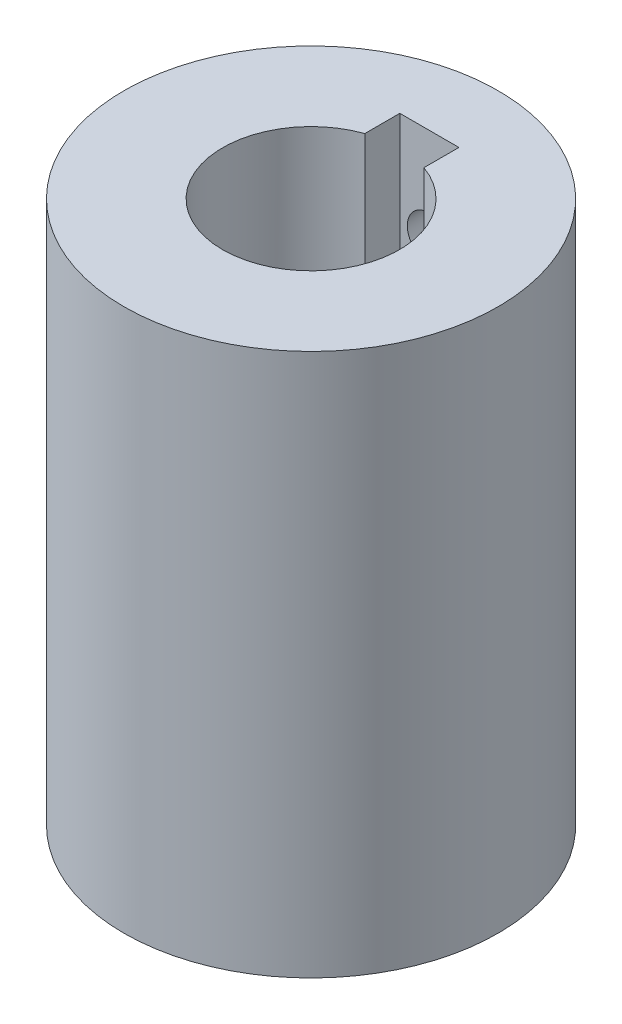
ISO-10303-21;
HEADER;
FILE_DESCRIPTION(('STEP AP214'),'2;1');
FILE_NAME('part.step','',(''),(''),'','','');
FILE_SCHEMA(('AUTOMOTIVE_DESIGN { 1 0 10303 214 1 1 1 1 }'));
ENDSEC;
DATA;
#1=APPLICATION_CONTEXT('core data for automotive mechanical design processes');
#2=APPLICATION_PROTOCOL_DEFINITION('international standard','automotive_design',2000,#1);
#3=PRODUCT_CONTEXT('',#1,'mechanical');
#4=PRODUCT('Part','Part','',(#3));
#5=PRODUCT_RELATED_PRODUCT_CATEGORY('part','',(#4));
#6=PRODUCT_DEFINITION_FORMATION('','',#4);
#7=PRODUCT_DEFINITION_CONTEXT('part definition',#1,'design');
#8=PRODUCT_DEFINITION('design','',#6,#7);
#9=PRODUCT_DEFINITION_SHAPE('','',#8);
#10=(LENGTH_UNIT() NAMED_UNIT(*) SI_UNIT(.MILLI.,.METRE.));
#11=(NAMED_UNIT(*) PLANE_ANGLE_UNIT() SI_UNIT($,.RADIAN.));
#12=(NAMED_UNIT(*) SI_UNIT($,.STERADIAN.) SOLID_ANGLE_UNIT());
#13=UNCERTAINTY_MEASURE_WITH_UNIT(LENGTH_MEASURE(1.E-05),#10,'distance_accuracy_value','');
#14=(GEOMETRIC_REPRESENTATION_CONTEXT(3) GLOBAL_UNCERTAINTY_ASSIGNED_CONTEXT((#13)) GLOBAL_UNIT_ASSIGNED_CONTEXT((#10,
#11,#12)) REPRESENTATION_CONTEXT('',''));
#15=CARTESIAN_POINT('',(0.,0.,0.));
#16=DIRECTION('',(0.,0.,1.));
#17=DIRECTION('',(1.,0.,0.));
#18=AXIS2_PLACEMENT_3D('',#15,#16,#17);
#19=CARTESIAN_POINT('',(0.,18.415,0.));
#20=DIRECTION('',(0.,-1.,0.));
#21=DIRECTION('',(0.,0.,-1.));
#22=AXIS2_PLACEMENT_3D('',#19,#20,#21);
#23=PLANE('',#22);
#24=CARTESIAN_POINT('',(0.,18.415,0.));
#25=DIRECTION('',(0.,-1.,0.));
#26=DIRECTION('',(0.,0.,-1.));
#27=AXIS2_PLACEMENT_3D('',#24,#25,#26);
#28=CIRCLE('',#27,6.);
#29=CARTESIAN_POINT('',(3.67958977400672,18.415,-4.73926356040948));
#30=VERTEX_POINT('',#29);
#31=CARTESIAN_POINT('',(2.26452775154114,18.415,-5.55625));
#32=VERTEX_POINT('',#31);
#33=EDGE_CURVE('E315',#30,#32,#28,.F.);
#34=ORIENTED_EDGE('',*,*,#33,.T.);
#35=DIRECTION('',(-1.,0.,0.));
#36=VECTOR('',#35,1.);
#37=CARTESIAN_POINT('',(0.,18.415,-5.55625));
#38=LINE('',#37,#36);
#39=CARTESIAN_POINT('',(3.20790243318486,18.415,-5.55625));
#40=VERTEX_POINT('',#39);
#41=EDGE_CURVE('E245',#40,#32,#38,.T.);
#42=ORIENTED_EDGE('',*,*,#41,.F.);
#43=DIRECTION('',(-0.5,0.,-0.866025403784439));
#44=VECTOR('',#43,1.);
#45=CARTESIAN_POINT('',(4.81185364977729,18.415,-2.778125));
#46=LINE('',#45,#44);
#47=EDGE_CURVE('E211',#30,#40,#46,.T.);
#48=ORIENTED_EDGE('',*,*,#47,.F.);
#49=EDGE_LOOP('',(#34,#42,#48));
#50=FACE_BOUND('',#49,.T.);
#51=ADVANCED_FACE('F41',(#50),#23,.T.);
#52=DIRECTION('',(-0.5,0.,0.866025403784439));
#53=VECTOR('',#52,1.);
#54=CARTESIAN_POINT('',(-4.81185364977729,18.415,-2.778125));
#55=LINE('',#54,#53);
#56=CARTESIAN_POINT('',(-3.20790243318486,18.415,-5.55625));
#57=VERTEX_POINT('',#56);
#58=CARTESIAN_POINT('',(-3.67958977400671,18.415,-4.73926356040949));
#59=VERTEX_POINT('',#58);
#60=EDGE_CURVE('E281',#57,#59,#55,.T.);
#61=ORIENTED_EDGE('',*,*,#60,.F.);
#62=CARTESIAN_POINT('',(-2.26452775154114,18.415,-5.55625));
#63=VERTEX_POINT('',#62);
#64=EDGE_CURVE('E70',#63,#57,#38,.T.);
#65=ORIENTED_EDGE('',*,*,#64,.F.);
#66=EDGE_CURVE('E330',#63,#59,#28,.F.);
#67=ORIENTED_EDGE('',*,*,#66,.T.);
#68=EDGE_LOOP('',(#61,#65,#67));
#69=FACE_BOUND('',#68,.T.);
#70=ADVANCED_FACE('F426',(#69),#23,.T.);
#71=CARTESIAN_POINT('',(5.94411752554786,18.415,0.816986439590518));
#72=VERTEX_POINT('',#71);
#73=CARTESIAN_POINT('',(5.94411752554786,18.415,-0.816986439590517));
#74=VERTEX_POINT('',#73);
#75=EDGE_CURVE('E384',#72,#74,#28,.F.);
#76=ORIENTED_EDGE('',*,*,#75,.T.);
#77=CARTESIAN_POINT('',(6.41580486636972,18.415,0.));
#78=VERTEX_POINT('',#77);
#79=EDGE_CURVE('E200',#78,#74,#46,.T.);
#80=ORIENTED_EDGE('',*,*,#79,.F.);
#81=DIRECTION('',(0.5,0.,-0.866025403784439));
#82=VECTOR('',#81,1.);
#83=CARTESIAN_POINT('',(4.81185364977729,18.415,2.778125));
#84=LINE('',#83,#82);
#85=EDGE_CURVE('E199',#72,#78,#84,.T.);
#86=ORIENTED_EDGE('',*,*,#85,.F.);
#87=EDGE_LOOP('',(#76,#80,#86));
#88=FACE_BOUND('',#87,.T.);
#89=ADVANCED_FACE('F431',(#88),#23,.T.);
#90=CARTESIAN_POINT('',(2.26452775154114,18.415,5.55625));
#91=VERTEX_POINT('',#90);
#92=CARTESIAN_POINT('',(3.67958977400672,18.415,4.73926356040949));
#93=VERTEX_POINT('',#92);
#94=EDGE_CURVE('E370',#91,#93,#28,.F.);
#95=ORIENTED_EDGE('',*,*,#94,.T.);
#96=CARTESIAN_POINT('',(3.20790243318486,18.415,5.55625));
#97=VERTEX_POINT('',#96);
#98=EDGE_CURVE('E257',#97,#93,#84,.T.);
#99=ORIENTED_EDGE('',*,*,#98,.F.);
#100=DIRECTION('',(1.,0.,0.));
#101=VECTOR('',#100,1.);
#102=CARTESIAN_POINT('',(0.,18.415,5.55625));
#103=LINE('',#102,#101);
#104=EDGE_CURVE('E268',#91,#97,#103,.T.);
#105=ORIENTED_EDGE('',*,*,#104,.F.);
#106=EDGE_LOOP('',(#95,#99,#105));
#107=FACE_BOUND('',#106,.T.);
#108=ADVANCED_FACE('F442',(#107),#23,.T.);
#109=CARTESIAN_POINT('',(-3.67958977400672,18.415,4.73926356040949));
#110=VERTEX_POINT('',#109);
#111=CARTESIAN_POINT('',(-2.26452775154114,18.415,5.55625));
#112=VERTEX_POINT('',#111);
#113=EDGE_CURVE('E356',#110,#112,#28,.F.);
#114=ORIENTED_EDGE('',*,*,#113,.T.);
#115=CARTESIAN_POINT('',(-3.20790243318486,18.415,5.55625));
#116=VERTEX_POINT('',#115);
#117=EDGE_CURVE('E262',#116,#112,#103,.T.);
#118=ORIENTED_EDGE('',*,*,#117,.F.);
#119=DIRECTION('',(0.5,0.,0.866025403784439));
#120=VECTOR('',#119,1.);
#121=CARTESIAN_POINT('',(-4.81185364977729,18.415,2.778125));
#122=LINE('',#121,#120);
#123=EDGE_CURVE('E277',#110,#116,#122,.T.);
#124=ORIENTED_EDGE('',*,*,#123,.F.);
#125=EDGE_LOOP('',(#114,#118,#124));
#126=FACE_BOUND('',#125,.T.);
#127=ADVANCED_FACE('F435',(#126),#23,.T.);
#128=CARTESIAN_POINT('',(-5.94411752554786,18.415,-0.81698643959051));
#129=VERTEX_POINT('',#128);
#130=CARTESIAN_POINT('',(-5.94411752554786,18.415,0.816986439590508));
#131=VERTEX_POINT('',#130);
#132=EDGE_CURVE('E340',#129,#131,#28,.F.);
#133=ORIENTED_EDGE('',*,*,#132,.T.);
#134=CARTESIAN_POINT('',(-6.41580486636972,18.415,0.));
#135=VERTEX_POINT('',#134);
#136=EDGE_CURVE('E271',#135,#131,#122,.T.);
#137=ORIENTED_EDGE('',*,*,#136,.F.);
#138=EDGE_CURVE('E287',#129,#135,#55,.T.);
#139=ORIENTED_EDGE('',*,*,#138,.F.);
#140=EDGE_LOOP('',(#133,#137,#139));
#141=FACE_BOUND('',#140,.T.);
#142=ADVANCED_FACE('F412',(#141),#23,.T.);
#143=CARTESIAN_POINT('',(0.,36.83,0.));
#144=DIRECTION('',(0.,-1.,0.));
#145=DIRECTION('',(0.,0.,-1.));
#146=AXIS2_PLACEMENT_3D('',#143,#144,#145);
#147=CYLINDRICAL_SURFACE('',#146,12.7);
#148=CARTESIAN_POINT('',(1.5,6.35,-12.6111062163476));
#149=CARTESIAN_POINT('',(1.49999640977252,6.26606022007603,-12.6111073630411));
#150=CARTESIAN_POINT('',(1.49293035142514,6.18206707141792,-12.6119533177293));
#151=CARTESIAN_POINT('',(1.46485268414268,6.01641569284176,-12.6152446948853));
#152=CARTESIAN_POINT('',(1.44382626576393,5.93476003864453,-12.617691815864));
#153=CARTESIAN_POINT('',(1.38845410928449,5.77620614824594,-12.6239045655693));
#154=CARTESIAN_POINT('',(1.35411712356428,5.69930482427662,-12.6276693277217));
#155=CARTESIAN_POINT('',(1.27311672920514,5.55237121936865,-12.6360921160261));
#156=CARTESIAN_POINT('',(1.22645552884779,5.48233771091851,-12.6407499821087));
#157=CARTESIAN_POINT('',(1.12188053460578,5.35076168387389,-12.6504603036079));
#158=CARTESIAN_POINT('',(1.06391734834539,5.28925854089039,-12.6555144306047));
#159=CARTESIAN_POINT('',(0.938489899521008,5.17682892417707,-12.6654327321389));
#160=CARTESIAN_POINT('',(0.871025176097145,5.1259029637766,-12.6702968974477));
#161=CARTESIAN_POINT('',(0.728263815128556,5.03593337302553,-12.6793041787112));
#162=CARTESIAN_POINT('',(0.652944696971424,4.99692517904565,-12.683445128913));
#163=CARTESIAN_POINT('',(0.496767779121411,4.9321253045689,-12.6905210810478));
#164=CARTESIAN_POINT('',(0.415910164020374,4.90633318383801,-12.6934561231497));
#165=CARTESIAN_POINT('',(0.251353085633446,4.86881469808402,-12.6977777959867));
#166=CARTESIAN_POINT('',(0.167668697803408,4.85702305244594,-12.6991716109596));
#167=CARTESIAN_POINT('',(-0.000501986907185979,4.84763802001992,-12.7002782903853));
#168=CARTESIAN_POINT('',(-0.0849882553291501,4.85004413122345,-12.6999912142716));
#169=CARTESIAN_POINT('',(-0.251920594258913,4.86893379601258,-12.6977742892663));
#170=CARTESIAN_POINT('',(-0.334374732909699,4.88534714601565,-12.6958526329661));
#171=CARTESIAN_POINT('',(-0.495349904017845,4.93167574223186,-12.6905917227892));
#172=CARTESIAN_POINT('',(-0.573870868533128,4.96159122159295,-12.6872524444337));
#173=CARTESIAN_POINT('',(-0.724969284586472,5.03415022962009,-12.6795174390432));
#174=CARTESIAN_POINT('',(-0.79753191424206,5.07682434264288,-12.6751191784579));
#175=CARTESIAN_POINT('',(-0.934492174906804,5.1736670220063,-12.6657587178985));
#176=CARTESIAN_POINT('',(-0.998889471335277,5.2278360591171,-12.6607964948316));
#177=CARTESIAN_POINT('',(-1.11810314009731,5.34652461569217,-12.6508281569663));
#178=CARTESIAN_POINT('',(-1.17285864206677,5.41110528597974,-12.6458219591217));
#179=CARTESIAN_POINT('',(-1.27076187478548,5.54857325819117,-12.6363598845365));
#180=CARTESIAN_POINT('',(-1.31390957581817,5.62146058137982,-12.6319040092047));
#181=CARTESIAN_POINT('',(-1.38737475412251,5.77352487103104,-12.6240470315681));
#182=CARTESIAN_POINT('',(-1.41768768802977,5.85270405298137,-12.620646302887));
#183=CARTESIAN_POINT('',(-1.46457061596496,6.01507778504808,-12.6152921001325));
#184=CARTESIAN_POINT('',(-1.48114119911468,6.09827216287493,-12.6133385640197));
#185=CARTESIAN_POINT('',(-1.49998912445038,6.265778062783,-12.6111111223017));
#186=CARTESIAN_POINT('',(-1.50235197920202,6.35007983446653,-12.6108271681534));
#187=CARTESIAN_POINT('',(-1.49294268932318,6.5178780433266,-12.611944484918));
#188=CARTESIAN_POINT('',(-1.48117081294108,6.60137449575614,-12.6133457238495));
#189=CARTESIAN_POINT('',(-1.44389808691238,6.76493773669147,-12.6176663834739));
#190=CARTESIAN_POINT('',(-1.4184383541997,6.84501402536882,-12.6205812564731));
#191=CARTESIAN_POINT('',(-1.35455484410683,6.99976050360252,-12.6275970685216));
#192=CARTESIAN_POINT('',(-1.31613065774757,7.0744305225214,-12.6316980449873));
#193=CARTESIAN_POINT('',(-1.22719753516893,7.21663259994591,-12.640648139657));
#194=CARTESIAN_POINT('',(-1.17663234650096,7.28412925794286,-12.6455007018698));
#195=CARTESIAN_POINT('',(-1.06493242629233,7.40970808983753,-12.6553962658947));
#196=CARTESIAN_POINT('',(-1.00379732843816,7.46778993731794,-12.6604392743022));
#197=CARTESIAN_POINT('',(-0.872320199154973,7.57318917396867,-12.670178228019));
#198=CARTESIAN_POINT('',(-0.801933058701241,7.62045049257152,-12.6748722840261));
#199=CARTESIAN_POINT('',(-0.654170260851635,7.70247976246808,-12.6833564223603));
#200=CARTESIAN_POINT('',(-0.57679473128108,7.73724794221714,-12.6871465212171));
#201=CARTESIAN_POINT('',(-0.4174406680671,7.7932106803739,-12.6933872799947));
#202=CARTESIAN_POINT('',(-0.335473798442014,7.81443807612811,-12.6958411781615));
#203=CARTESIAN_POINT('',(-0.169108514761832,7.84282361152357,-12.6991464510907));
#204=CARTESIAN_POINT('',(-0.0847101981572978,7.84998231423368,-12.6999978899879));
#205=CARTESIAN_POINT('',(0.0835737874508729,7.85001751368946,-12.7000020895594));
#206=CARTESIAN_POINT('',(0.167459451347094,7.84298063969374,-12.6991651536303));
#207=CARTESIAN_POINT('',(0.332847371824224,7.81500737290691,-12.6959070668417));
#208=CARTESIAN_POINT('',(0.414349628879296,7.79407098288102,-12.6934859162975));
#209=CARTESIAN_POINT('',(0.572648952289882,7.73891927496915,-12.6873303392561));
#210=CARTESIAN_POINT('',(0.649447316230781,7.7047076383819,-12.6835962768635));
#211=CARTESIAN_POINT('',(0.796226238393341,7.62398556803596,-12.6752291686619));
#212=CARTESIAN_POINT('',(0.866206751005759,7.57747505200944,-12.6705961168395));
#213=CARTESIAN_POINT('',(0.997806624046717,7.47315345534259,-12.6609149785306));
#214=CARTESIAN_POINT('',(1.05937467211846,7.41527785258845,-12.6558646224608));
#215=CARTESIAN_POINT('',(1.17195987164625,7.29000171739053,-12.645936620901));
#216=CARTESIAN_POINT('',(1.22297451196119,7.22259892439749,-12.6410590167449));
#217=CARTESIAN_POINT('',(1.31315290067421,7.07991717495939,-12.6320107971434));
#218=CARTESIAN_POINT('',(1.35227506304203,7.0046117913843,-12.6278426845248));
#219=CARTESIAN_POINT('',(1.41726371519299,6.84849487376944,-12.620714798872));
#220=CARTESIAN_POINT('',(1.44314478170326,6.76768950605936,-12.6177536978083));
#221=CARTESIAN_POINT('',(1.47464317387984,6.63037810960231,-12.614102407162));
#222=CARTESIAN_POINT('',(1.48413851453482,6.57474194804356,-12.6129843462527));
#223=CARTESIAN_POINT('',(1.49681811294221,6.46274521482581,-12.6114858681064));
#224=CARTESIAN_POINT('',(1.50000241165408,6.40638464787067,-12.6111054460821));
#225=CARTESIAN_POINT('',(1.5,6.35,-12.6111062163476));
#226=B_SPLINE_CURVE_WITH_KNOTS('',3,(#148,#149,#150,#151,#152,#153,#154,#155,#156,#157,#158,
#159,#160,#161,#162,#163,#164,#165,#166,#167,#168,#169,#170,#171,#172,#173,#174,#175,#176,#177,
#178,#179,#180,#181,#182,#183,#184,#185,#186,#187,#188,#189,#190,#191,#192,#193,#194,#195,#196,
#197,#198,#199,#200,#201,#202,#203,#204,#205,#206,#207,#208,#209,#210,#211,#212,#213,#214,#215,
#216,#217,#218,#219,#220,#221,#222,#223,#224,#225),.UNSPECIFIED.,.T.,.F.,(4,2,2,2,2,2,2,2,2,2,2,
2,2,2,2,2,2,2,2,2,2,2,2,2,2,2,2,2,2,2,2,2,2,2,2,2,2,2,4),(0.,0.251613380748292,
0.503494105646093,0.75520948623113,1.00687979442843,1.25967566386849,1.51248379907322,
1.76603647969038,2.0195807137912,2.27193803464322,2.52428643262321,2.77537745114223,
3.02647280554002,3.27817496610754,3.5298874370301,3.78313609467784,4.03638540064911,
4.28972427925203,4.54305229689169,4.79485406155235,5.04665104760417,5.29769585292151,
5.54874857848584,5.80098773913409,6.05323564320078,6.3067624835944,6.56028468764223,
6.8131897215963,7.06608463337017,7.31744090938854,7.568797135401,7.82008370870756,
8.07137196292548,8.32413038231695,8.57694887555923,8.83064152451594,9.08405428658975,
9.25307097883103,9.42208657412913),.UNSPECIFIED.);
#227=CARTESIAN_POINT('',(1.5,6.35,-12.6111062163476));
#228=VERTEX_POINT('',#227);
#229=EDGE_CURVE('E729',#228,#228,#226,.T.);
#230=ORIENTED_EDGE('',*,*,#229,.F.);
#231=EDGE_LOOP('',(#230));
#232=FACE_BOUND('',#231,.T.);
#233=CARTESIAN_POINT('',(1.5,30.48,-12.6111062163476));
#234=CARTESIAN_POINT('',(1.49999640977252,30.396060220076,-12.6111073630411));
#235=CARTESIAN_POINT('',(1.49293035142514,30.3120670714179,-12.6119533177293));
#236=CARTESIAN_POINT('',(1.46485268414268,30.1464156928418,-12.6152446948853));
#237=CARTESIAN_POINT('',(1.44382626576393,30.0647600386445,-12.617691815864));
#238=CARTESIAN_POINT('',(1.38845410928449,29.9062061482459,-12.6239045655693));
#239=CARTESIAN_POINT('',(1.35411712356428,29.8293048242766,-12.6276693277217));
#240=CARTESIAN_POINT('',(1.27311672920514,29.6823712193686,-12.6360921160261));
#241=CARTESIAN_POINT('',(1.22645552884779,29.6123377109185,-12.6407499821087));
#242=CARTESIAN_POINT('',(1.12188053460578,29.4807616838739,-12.6504603036079));
#243=CARTESIAN_POINT('',(1.06391734834539,29.4192585408904,-12.6555144306047));
#244=CARTESIAN_POINT('',(0.938489899521008,29.3068289241771,-12.6654327321389));
#245=CARTESIAN_POINT('',(0.871025176097144,29.2559029637766,-12.6702968974477));
#246=CARTESIAN_POINT('',(0.728263815128555,29.1659333730255,-12.6793041787112));
#247=CARTESIAN_POINT('',(0.652944696971424,29.1269251790456,-12.683445128913));
#248=CARTESIAN_POINT('',(0.49676777912141,29.0621253045689,-12.6905210810478));
#249=CARTESIAN_POINT('',(0.415910164020373,29.036333183838,-12.6934561231497));
#250=CARTESIAN_POINT('',(0.251353085633444,28.998814698084,-12.6977777959867));
#251=CARTESIAN_POINT('',(0.167668697803406,28.9870230524459,-12.6991716109596));
#252=CARTESIAN_POINT('',(-0.000501986907188161,28.9776380200199,-12.7002782903853));
#253=CARTESIAN_POINT('',(-0.0849882553291526,28.9800441312234,-12.6999912142716));
#254=CARTESIAN_POINT('',(-0.251920594258916,28.9989337960126,-12.6977742892663));
#255=CARTESIAN_POINT('',(-0.334374732909702,29.0153471460156,-12.6958526329661));
#256=CARTESIAN_POINT('',(-0.495349904017849,29.0616757422319,-12.6905917227892));
#257=CARTESIAN_POINT('',(-0.573870868533132,29.0915912215929,-12.6872524444337));
#258=CARTESIAN_POINT('',(-0.724969284586475,29.1641502296201,-12.6795174390432));
#259=CARTESIAN_POINT('',(-0.797531914242063,29.2068243426429,-12.6751191784579));
#260=CARTESIAN_POINT('',(-0.934492174906808,29.3036670220063,-12.6657587178985));
#261=CARTESIAN_POINT('',(-0.998889471335281,29.3578360591171,-12.6607964948316));
#262=CARTESIAN_POINT('',(-1.11810314009732,29.4765246156922,-12.6508281569663));
#263=CARTESIAN_POINT('',(-1.17285864206677,29.5411052859797,-12.6458219591217));
#264=CARTESIAN_POINT('',(-1.27076187478549,29.6785732581912,-12.6363598845365));
#265=CARTESIAN_POINT('',(-1.31390957581817,29.7514605813798,-12.6319040092047));
#266=CARTESIAN_POINT('',(-1.38737475412251,29.903524871031,-12.6240470315681));
#267=CARTESIAN_POINT('',(-1.41768768802977,29.9827040529814,-12.620646302887));
#268=CARTESIAN_POINT('',(-1.46457061596497,30.1450777850481,-12.6152921001325));
#269=CARTESIAN_POINT('',(-1.48114119911468,30.2282721628749,-12.6133385640197));
#270=CARTESIAN_POINT('',(-1.49998912445039,30.395778062783,-12.6111111223017));
#271=CARTESIAN_POINT('',(-1.50235197920203,30.4800798344665,-12.6108271681534));
#272=CARTESIAN_POINT('',(-1.49294268932318,30.6478780433266,-12.611944484918));
#273=CARTESIAN_POINT('',(-1.48117081294109,30.7313744957561,-12.6133457238495));
#274=CARTESIAN_POINT('',(-1.44389808691238,30.8949377366915,-12.6176663834739));
#275=CARTESIAN_POINT('',(-1.4184383541997,30.9750140253688,-12.6205812564731));
#276=CARTESIAN_POINT('',(-1.35455484410684,31.1297605036025,-12.6275970685216));
#277=CARTESIAN_POINT('',(-1.31613065774757,31.2044305225214,-12.6316980449873));
#278=CARTESIAN_POINT('',(-1.22719753516893,31.3466325999459,-12.640648139657));
#279=CARTESIAN_POINT('',(-1.17663234650096,31.4141292579429,-12.6455007018698));
#280=CARTESIAN_POINT('',(-1.06493242629233,31.5397080898375,-12.6553962658947));
#281=CARTESIAN_POINT('',(-1.00379732843816,31.5977899373179,-12.6604392743022));
#282=CARTESIAN_POINT('',(-0.872320199154976,31.7031891739687,-12.670178228019));
#283=CARTESIAN_POINT('',(-0.801933058701242,31.7504504925715,-12.6748722840261));
#284=CARTESIAN_POINT('',(-0.654170260851637,31.8324797624681,-12.6833564223603));
#285=CARTESIAN_POINT('',(-0.576794731281083,31.8672479422171,-12.6871465212171));
#286=CARTESIAN_POINT('',(-0.417440668067103,31.9232106803739,-12.6933872799947));
#287=CARTESIAN_POINT('',(-0.335473798442017,31.9444380761281,-12.6958411781615));
#288=CARTESIAN_POINT('',(-0.169108514761834,31.9728236115236,-12.6991464510907));
#289=CARTESIAN_POINT('',(-0.0847101981572995,31.9799823142337,-12.6999978899879));
#290=CARTESIAN_POINT('',(0.0835737874508713,31.9800175136895,-12.7000020895594));
#291=CARTESIAN_POINT('',(0.167459451347092,31.9729806396937,-12.6991651536303));
#292=CARTESIAN_POINT('',(0.332847371824222,31.9450073729069,-12.6959070668417));
#293=CARTESIAN_POINT('',(0.414349628879294,31.924070982881,-12.6934859162975));
#294=CARTESIAN_POINT('',(0.572648952289879,31.8689192749691,-12.6873303392561));
#295=CARTESIAN_POINT('',(0.649447316230777,31.8347076383819,-12.6835962768635));
#296=CARTESIAN_POINT('',(0.796226238393337,31.753985568036,-12.6752291686619));
#297=CARTESIAN_POINT('',(0.866206751005755,31.7074750520094,-12.6705961168395));
#298=CARTESIAN_POINT('',(0.997806624046714,31.6031534553426,-12.6609149785306));
#299=CARTESIAN_POINT('',(1.05937467211846,31.5452778525884,-12.6558646224608));
#300=CARTESIAN_POINT('',(1.17195987164624,31.4200017173905,-12.645936620901));
#301=CARTESIAN_POINT('',(1.22297451196118,31.3525989243975,-12.6410590167449));
#302=CARTESIAN_POINT('',(1.31315290067421,31.2099171749594,-12.6320107971434));
#303=CARTESIAN_POINT('',(1.35227506304202,31.1346117913843,-12.6278426845248));
#304=CARTESIAN_POINT('',(1.41726371519299,30.9784948737694,-12.620714798872));
#305=CARTESIAN_POINT('',(1.44314478170325,30.8976895060594,-12.6177536978083));
#306=CARTESIAN_POINT('',(1.47464317387984,30.7603781096023,-12.614102407162));
#307=CARTESIAN_POINT('',(1.48413851453481,30.7047419480436,-12.6129843462527));
#308=CARTESIAN_POINT('',(1.4968181129422,30.5927452148258,-12.6114858681064));
#309=CARTESIAN_POINT('',(1.50000241165408,30.5363846478707,-12.6111054460821));
#310=CARTESIAN_POINT('',(1.5,30.48,-12.6111062163476));
#311=B_SPLINE_CURVE_WITH_KNOTS('',3,(#233,#234,#235,#236,#237,#238,#239,#240,#241,#242,#243,
#244,#245,#246,#247,#248,#249,#250,#251,#252,#253,#254,#255,#256,#257,#258,#259,#260,#261,#262,
#263,#264,#265,#266,#267,#268,#269,#270,#271,#272,#273,#274,#275,#276,#277,#278,#279,#280,#281,
#282,#283,#284,#285,#286,#287,#288,#289,#290,#291,#292,#293,#294,#295,#296,#297,#298,#299,#300,
#301,#302,#303,#304,#305,#306,#307,#308,#309,#310),.UNSPECIFIED.,.T.,.F.,(4,2,2,2,2,2,2,2,2,2,2,
2,2,2,2,2,2,2,2,2,2,2,2,2,2,2,2,2,2,2,2,2,2,2,2,2,2,2,4),(0.,0.251613380748293,
0.503494105646093,0.755209486231131,1.00687979442842,1.25967566386849,1.51248379907322,
1.76603647969037,2.0195807137912,2.27193803464322,2.52428643262321,2.77537745114223,
3.02647280554002,3.27817496610754,3.5298874370301,3.78313609467784,4.03638540064911,
4.28972427925204,4.5430522968917,4.79485406155236,5.04665104760418,5.29769585292151,
5.54874857848584,5.8009877391341,6.05323564320079,6.30676248359441,6.56028468764224,
6.8131897215963,7.06608463337017,7.31744090938855,7.56879713540101,7.82008370870756,
8.07137196292549,8.32413038231696,8.57694887555924,8.83064152451595,9.08405428658976,
9.25307097883104,9.42208657412913),.UNSPECIFIED.);
#312=CARTESIAN_POINT('',(1.5,30.48,-12.6111062163476));
#313=VERTEX_POINT('',#312);
#314=EDGE_CURVE('E228',#313,#313,#311,.T.);
#315=ORIENTED_EDGE('',*,*,#314,.F.);
#316=EDGE_LOOP('',(#315));
#317=FACE_BOUND('',#316,.T.);
#318=CARTESIAN_POINT('',(0.,36.83,0.));
#319=DIRECTION('',(0.,1.,0.));
#320=DIRECTION('',(0.,0.,1.));
#321=AXIS2_PLACEMENT_3D('',#318,#319,#320);
#322=CIRCLE('',#321,12.7);
#323=CARTESIAN_POINT('',(0.,36.83,12.7));
#324=VERTEX_POINT('',#323);
#325=EDGE_CURVE('E11',#324,#324,#322,.T.);
#326=ORIENTED_EDGE('',*,*,#325,.F.);
#327=EDGE_LOOP('',(#326));
#328=FACE_BOUND('',#327,.T.);
#329=CARTESIAN_POINT('',(0.,0.,0.));
#330=DIRECTION('',(0.,1.,0.));
#331=DIRECTION('',(0.,0.,1.));
#332=AXIS2_PLACEMENT_3D('',#329,#330,#331);
#333=CIRCLE('',#332,12.7);
#334=CARTESIAN_POINT('',(0.,0.,12.7));
#335=VERTEX_POINT('',#334);
#336=EDGE_CURVE('E45',#335,#335,#333,.T.);
#337=ORIENTED_EDGE('',*,*,#336,.T.);
#338=EDGE_LOOP('',(#337));
#339=FACE_BOUND('',#338,.T.);
#340=ADVANCED_FACE('F43',(#232,#317,#328,#339),#147,.T.);
#341=CARTESIAN_POINT('',(0.,36.83,0.));
#342=DIRECTION('',(0.,1.,0.));
#343=DIRECTION('',(0.,0.,1.));
#344=AXIS2_PLACEMENT_3D('',#341,#342,#343);
#345=PLANE('',#344);
#346=DIRECTION('',(0.,0.,1.));
#347=VECTOR('',#346,1.);
#348=CARTESIAN_POINT('',(-2.0066,36.83,-8.032));
#349=LINE('',#348,#347);
#350=CARTESIAN_POINT('',(-2.0066,36.83,-8.032));
#351=VERTEX_POINT('',#350);
#352=CARTESIAN_POINT('',(-2.0066,36.83,-5.65451646385436));
#353=VERTEX_POINT('',#352);
#354=EDGE_CURVE('E294',#351,#353,#349,.T.);
#355=ORIENTED_EDGE('',*,*,#354,.F.);
#356=DIRECTION('',(-1.,0.,0.));
#357=VECTOR('',#356,1.);
#358=CARTESIAN_POINT('',(0.,36.83,-8.032));
#359=LINE('',#358,#357);
#360=CARTESIAN_POINT('',(2.0066,36.83,-8.032));
#361=VERTEX_POINT('',#360);
#362=EDGE_CURVE('E293',#361,#351,#359,.T.);
#363=ORIENTED_EDGE('',*,*,#362,.F.);
#364=DIRECTION('',(0.,0.,-1.));
#365=VECTOR('',#364,1.);
#366=CARTESIAN_POINT('',(2.0066,36.83,-8.032));
#367=LINE('',#366,#365);
#368=CARTESIAN_POINT('',(2.0066,36.83,-5.65451646385436));
#369=VERTEX_POINT('',#368);
#370=EDGE_CURVE('E285',#369,#361,#367,.T.);
#371=ORIENTED_EDGE('',*,*,#370,.F.);
#372=CARTESIAN_POINT('',(0.,36.83,0.));
#373=DIRECTION('',(0.,1.,0.));
#374=DIRECTION('',(0.,0.,1.));
#375=AXIS2_PLACEMENT_3D('',#372,#373,#374);
#376=CIRCLE('',#375,6.);
#377=EDGE_CURVE('E323',#353,#369,#376,.T.);
#378=ORIENTED_EDGE('',*,*,#377,.F.);
#379=EDGE_LOOP('',(#355,#363,#371,#378));
#380=FACE_BOUND('',#379,.T.);
#381=ORIENTED_EDGE('',*,*,#325,.T.);
#382=EDGE_LOOP('',(#381));
#383=FACE_BOUND('',#382,.T.);
#384=ADVANCED_FACE('F440',(#380,#383),#345,.T.);
#385=CARTESIAN_POINT('',(0.,0.,0.));
#386=DIRECTION('',(0.,1.,0.));
#387=DIRECTION('',(0.,0.,1.));
#388=AXIS2_PLACEMENT_3D('',#385,#386,#387);
#389=PLANE('',#388);
#390=DIRECTION('',(-0.5,0.,-0.866025403784439));
#391=VECTOR('',#390,1.);
#392=CARTESIAN_POINT('',(-4.81185364977729,0.,2.778125));
#393=LINE('',#392,#391);
#394=CARTESIAN_POINT('',(-3.20790243318486,0.,5.55625));
#395=VERTEX_POINT('',#394);
#396=CARTESIAN_POINT('',(-6.41580486636972,0.,0.));
#397=VERTEX_POINT('',#396);
#398=EDGE_CURVE('E266',#395,#397,#393,.T.);
#399=ORIENTED_EDGE('',*,*,#398,.F.);
#400=DIRECTION('',(-1.,0.,0.));
#401=VECTOR('',#400,1.);
#402=CARTESIAN_POINT('',(0.,0.,5.55625));
#403=LINE('',#402,#401);
#404=CARTESIAN_POINT('',(3.20790243318486,0.,5.55625));
#405=VERTEX_POINT('',#404);
#406=EDGE_CURVE('E193',#405,#395,#403,.T.);
#407=ORIENTED_EDGE('',*,*,#406,.F.);
#408=DIRECTION('',(-0.5,0.,0.866025403784439));
#409=VECTOR('',#408,1.);
#410=CARTESIAN_POINT('',(4.81185364977729,0.,2.778125));
#411=LINE('',#410,#409);
#412=CARTESIAN_POINT('',(6.41580486636972,0.,0.));
#413=VERTEX_POINT('',#412);
#414=EDGE_CURVE('E185',#413,#405,#411,.T.);
#415=ORIENTED_EDGE('',*,*,#414,.F.);
#416=DIRECTION('',(0.5,0.,0.866025403784439));
#417=VECTOR('',#416,1.);
#418=CARTESIAN_POINT('',(4.81185364977729,0.,-2.778125));
#419=LINE('',#418,#417);
#420=CARTESIAN_POINT('',(3.20790243318486,0.,-5.55625));
#421=VERTEX_POINT('',#420);
#422=EDGE_CURVE('E190',#421,#413,#419,.T.);
#423=ORIENTED_EDGE('',*,*,#422,.F.);
#424=DIRECTION('',(1.,0.,0.));
#425=VECTOR('',#424,1.);
#426=CARTESIAN_POINT('',(0.,0.,-5.55625));
#427=LINE('',#426,#425);
#428=CARTESIAN_POINT('',(-3.20790243318486,0.,-5.55625));
#429=VERTEX_POINT('',#428);
#430=EDGE_CURVE('E223',#429,#421,#427,.T.);
#431=ORIENTED_EDGE('',*,*,#430,.F.);
#432=DIRECTION('',(0.5,0.,-0.866025403784439));
#433=VECTOR('',#432,1.);
#434=CARTESIAN_POINT('',(-4.81185364977729,0.,-2.778125));
#435=LINE('',#434,#433);
#436=EDGE_CURVE('E275',#397,#429,#435,.T.);
#437=ORIENTED_EDGE('',*,*,#436,.F.);
#438=EDGE_LOOP('',(#399,#407,#415,#423,#431,#437));
#439=FACE_BOUND('',#438,.T.);
#440=ORIENTED_EDGE('',*,*,#336,.F.);
#441=EDGE_LOOP('',(#440));
#442=FACE_BOUND('',#441,.T.);
#443=ADVANCED_FACE('F187',(#439,#442),#389,.F.);
#444=CARTESIAN_POINT('',(0.,-0.001000000000001,0.));
#445=DIRECTION('',(0.,1.,0.));
#446=DIRECTION('',(0.,0.,1.));
#447=AXIS2_PLACEMENT_3D('',#444,#445,#446);
#448=CYLINDRICAL_SURFACE('',#447,6.);
#449=CARTESIAN_POINT('',(-2.0066,18.415,-5.65451646385436));
#450=VERTEX_POINT('',#449);
#451=EDGE_CURVE('E327',#450,#63,#28,.F.);
#452=ORIENTED_EDGE('',*,*,#451,.F.);
#453=DIRECTION('',(0.,1.,0.));
#454=VECTOR('',#453,1.);
#455=CARTESIAN_POINT('',(-2.0066,13.7504311877041,-5.65451646385436));
#456=LINE('',#455,#454);
#457=EDGE_CURVE('E312',#450,#353,#456,.T.);
#458=ORIENTED_EDGE('',*,*,#457,.T.);
#459=ORIENTED_EDGE('',*,*,#377,.T.);
#460=DIRECTION('',(0.,1.,0.));
#461=VECTOR('',#460,1.);
#462=CARTESIAN_POINT('',(2.0066,13.7504311877041,-5.65451646385436));
#463=LINE('',#462,#461);
#464=CARTESIAN_POINT('',(2.0066,18.415,-5.65451646385436));
#465=VERTEX_POINT('',#464);
#466=EDGE_CURVE('E308',#465,#369,#463,.T.);
#467=ORIENTED_EDGE('',*,*,#466,.F.);
#468=CARTESIAN_POINT('',(0.,18.415,0.));
#469=DIRECTION('',(0.,-1.,0.));
#470=DIRECTION('',(0.,0.,-1.));
#471=AXIS2_PLACEMENT_3D('',#468,#469,#470);
#472=CIRCLE('',#471,6.);
#473=EDGE_CURVE('E60',#32,#465,#472,.F.);
#474=ORIENTED_EDGE('',*,*,#473,.F.);
#475=ORIENTED_EDGE('',*,*,#33,.F.);
#476=EDGE_CURVE('E389',#74,#30,#28,.F.);
#477=ORIENTED_EDGE('',*,*,#476,.F.);
#478=ORIENTED_EDGE('',*,*,#75,.F.);
#479=EDGE_CURVE('E376',#93,#72,#28,.F.);
#480=ORIENTED_EDGE('',*,*,#479,.F.);
#481=ORIENTED_EDGE('',*,*,#94,.F.);
#482=EDGE_CURVE('E362',#112,#91,#28,.F.);
#483=ORIENTED_EDGE('',*,*,#482,.F.);
#484=ORIENTED_EDGE('',*,*,#113,.F.);
#485=EDGE_CURVE('E348',#131,#110,#28,.F.);
#486=ORIENTED_EDGE('',*,*,#485,.F.);
#487=ORIENTED_EDGE('',*,*,#132,.F.);
#488=EDGE_CURVE('E331',#59,#129,#28,.F.);
#489=ORIENTED_EDGE('',*,*,#488,.F.);
#490=ORIENTED_EDGE('',*,*,#66,.F.);
#491=EDGE_LOOP('',(#452,#458,#459,#467,#474,#475,#477,#478,#480,#481,#483,#484,#486,#487,#489,#490));
#492=FACE_BOUND('',#491,.T.);
#493=ADVANCED_FACE('F542',(#492),#448,.F.);
#494=CARTESIAN_POINT('',(0.,18.415,0.));
#495=DIRECTION('',(0.,-1.,0.));
#496=DIRECTION('',(0.,0.,-1.));
#497=AXIS2_PLACEMENT_3D('',#494,#495,#496);
#498=PLANE('',#497);
#499=DIRECTION('',(0.,0.,-1.));
#500=VECTOR('',#499,1.);
#501=CARTESIAN_POINT('',(2.0066,18.415,-8.032));
#502=LINE('',#501,#500);
#503=CARTESIAN_POINT('',(2.0066,18.415,-8.032));
#504=VERTEX_POINT('',#503);
#505=EDGE_CURVE('E304',#465,#504,#502,.T.);
#506=ORIENTED_EDGE('',*,*,#505,.T.);
#507=DIRECTION('',(-1.,0.,0.));
#508=VECTOR('',#507,1.);
#509=CARTESIAN_POINT('',(0.,18.415,-8.032));
#510=LINE('',#509,#508);
#511=CARTESIAN_POINT('',(-2.0066,18.415,-8.032));
#512=VERTEX_POINT('',#511);
#513=EDGE_CURVE('E297',#504,#512,#510,.T.);
#514=ORIENTED_EDGE('',*,*,#513,.T.);
#515=DIRECTION('',(0.,0.,1.));
#516=VECTOR('',#515,1.);
#517=CARTESIAN_POINT('',(-2.0066,18.415,-8.032));
#518=LINE('',#517,#516);
#519=EDGE_CURVE('E309',#512,#450,#518,.T.);
#520=ORIENTED_EDGE('',*,*,#519,.T.);
#521=ORIENTED_EDGE('',*,*,#451,.T.);
#522=EDGE_CURVE('E249',#32,#63,#38,.T.);
#523=ORIENTED_EDGE('',*,*,#522,.F.);
#524=ORIENTED_EDGE('',*,*,#473,.T.);
#525=EDGE_LOOP('',(#506,#514,#520,#521,#523,#524));
#526=FACE_BOUND('',#525,.T.);
#527=ADVANCED_FACE('F402',(#526),#498,.F.);
#528=CARTESIAN_POINT('',(0.,13.7504311877041,-8.032));
#529=DIRECTION('',(0.,0.,-1.));
#530=DIRECTION('',(-1.,0.,0.));
#531=AXIS2_PLACEMENT_3D('',#528,#529,#530);
#532=PLANE('',#531);
#533=CARTESIAN_POINT('',(0.,30.48,-8.032));
#534=DIRECTION('',(0.,0.,-1.));
#535=DIRECTION('',(-1.,0.,0.));
#536=AXIS2_PLACEMENT_3D('',#533,#534,#535);
#537=CIRCLE('',#536,1.5);
#538=CARTESIAN_POINT('',(-1.5,30.48,-8.032));
#539=VERTEX_POINT('',#538);
#540=EDGE_CURVE('E735',#539,#539,#537,.F.);
#541=ORIENTED_EDGE('',*,*,#540,.F.);
#542=EDGE_LOOP('',(#541));
#543=FACE_BOUND('',#542,.T.);
#544=DIRECTION('',(0.,1.,0.));
#545=VECTOR('',#544,1.);
#546=CARTESIAN_POINT('',(2.0066,13.7504311877041,-8.032));
#547=LINE('',#546,#545);
#548=EDGE_CURVE('E307',#504,#361,#547,.T.);
#549=ORIENTED_EDGE('',*,*,#548,.T.);
#550=ORIENTED_EDGE('',*,*,#362,.T.);
#551=DIRECTION('',(0.,1.,0.));
#552=VECTOR('',#551,1.);
#553=CARTESIAN_POINT('',(-2.0066,13.7504311877041,-8.032));
#554=LINE('',#553,#552);
#555=EDGE_CURVE('E303',#512,#351,#554,.T.);
#556=ORIENTED_EDGE('',*,*,#555,.F.);
#557=ORIENTED_EDGE('',*,*,#513,.F.);
#558=EDGE_LOOP('',(#549,#550,#556,#557));
#559=FACE_BOUND('',#558,.T.);
#560=ADVANCED_FACE('F531',(#543,#559),#532,.F.);
#561=CARTESIAN_POINT('',(-2.0066,13.7504311877041,-8.032));
#562=DIRECTION('',(-1.,0.,0.));
#563=DIRECTION('',(0.,0.,1.));
#564=AXIS2_PLACEMENT_3D('',#561,#562,#563);
#565=PLANE('',#564);
#566=ORIENTED_EDGE('',*,*,#555,.T.);
#567=ORIENTED_EDGE('',*,*,#354,.T.);
#568=ORIENTED_EDGE('',*,*,#457,.F.);
#569=ORIENTED_EDGE('',*,*,#519,.F.);
#570=EDGE_LOOP('',(#566,#567,#568,#569));
#571=FACE_BOUND('',#570,.T.);
#572=ADVANCED_FACE('F520',(#571),#565,.F.);
#573=CARTESIAN_POINT('',(2.0066,13.7504311877041,-8.032));
#574=DIRECTION('',(1.,0.,0.));
#575=DIRECTION('',(0.,0.,-1.));
#576=AXIS2_PLACEMENT_3D('',#573,#574,#575);
#577=PLANE('',#576);
#578=ORIENTED_EDGE('',*,*,#466,.T.);
#579=ORIENTED_EDGE('',*,*,#370,.T.);
#580=ORIENTED_EDGE('',*,*,#548,.F.);
#581=ORIENTED_EDGE('',*,*,#505,.F.);
#582=EDGE_LOOP('',(#578,#579,#580,#581));
#583=FACE_BOUND('',#582,.T.);
#584=ADVANCED_FACE('F510',(#583),#577,.F.);
#585=CARTESIAN_POINT('',(0.,18.415,0.));
#586=DIRECTION('',(0.,-1.,0.));
#587=DIRECTION('',(0.,0.,-1.));
#588=AXIS2_PLACEMENT_3D('',#585,#586,#587);
#589=PLANE('',#588);
#590=EDGE_CURVE('E286',#59,#129,#55,.T.);
#591=ORIENTED_EDGE('',*,*,#590,.F.);
#592=ORIENTED_EDGE('',*,*,#488,.T.);
#593=EDGE_LOOP('',(#591,#592));
#594=FACE_BOUND('',#593,.T.);
#595=ADVANCED_FACE('F422',(#594),#589,.F.);
#596=CARTESIAN_POINT('',(-4.81185364977729,24.6143856802509,-2.778125));
#597=DIRECTION('',(-0.866025403784439,0.,-0.5));
#598=DIRECTION('',(-0.5,0.,0.866025403784439));
#599=AXIS2_PLACEMENT_3D('',#596,#597,#598);
#600=PLANE('',#599);
#601=ORIENTED_EDGE('',*,*,#436,.T.);
#602=DIRECTION('',(0.,-1.,0.));
#603=VECTOR('',#602,1.);
#604=CARTESIAN_POINT('',(-3.20790243318486,18.6560705873961,-5.55625));
#605=LINE('',#604,#603);
#606=EDGE_CURVE('E225',#57,#429,#605,.T.);
#607=ORIENTED_EDGE('',*,*,#606,.F.);
#608=ORIENTED_EDGE('',*,*,#60,.T.);
#609=ORIENTED_EDGE('',*,*,#590,.T.);
#610=ORIENTED_EDGE('',*,*,#138,.T.);
#611=DIRECTION('',(0.,-1.,0.));
#612=VECTOR('',#611,1.);
#613=CARTESIAN_POINT('',(-6.41580486636972,18.6560705873961,0.));
#614=LINE('',#613,#612);
#615=EDGE_CURVE('E238',#135,#397,#614,.T.);
#616=ORIENTED_EDGE('',*,*,#615,.T.);
#617=EDGE_LOOP('',(#601,#607,#608,#609,#610,#616));
#618=FACE_BOUND('',#617,.T.);
#619=ADVANCED_FACE('F411',(#618),#600,.F.);
#620=CARTESIAN_POINT('',(0.,18.415,0.));
#621=DIRECTION('',(0.,-1.,0.));
#622=DIRECTION('',(0.,0.,-1.));
#623=AXIS2_PLACEMENT_3D('',#620,#621,#622);
#624=PLANE('',#623);
#625=EDGE_CURVE('E276',#131,#110,#122,.T.);
#626=ORIENTED_EDGE('',*,*,#625,.F.);
#627=ORIENTED_EDGE('',*,*,#485,.T.);
#628=EDGE_LOOP('',(#626,#627));
#629=FACE_BOUND('',#628,.T.);
#630=ADVANCED_FACE('F413',(#629),#624,.F.);
#631=CARTESIAN_POINT('',(-4.81185364977729,24.6143856802509,2.778125));
#632=DIRECTION('',(-0.866025403784439,0.,0.5));
#633=DIRECTION('',(0.5,0.,0.866025403784439));
#634=AXIS2_PLACEMENT_3D('',#631,#632,#633);
#635=PLANE('',#634);
#636=ORIENTED_EDGE('',*,*,#398,.T.);
#637=ORIENTED_EDGE('',*,*,#615,.F.);
#638=ORIENTED_EDGE('',*,*,#136,.T.);
#639=ORIENTED_EDGE('',*,*,#625,.T.);
#640=ORIENTED_EDGE('',*,*,#123,.T.);
#641=DIRECTION('',(0.,-1.,0.));
#642=VECTOR('',#641,1.);
#643=CARTESIAN_POINT('',(-3.20790243318486,18.6560705873961,5.55625));
#644=LINE('',#643,#642);
#645=EDGE_CURVE('E241',#116,#395,#644,.T.);
#646=ORIENTED_EDGE('',*,*,#645,.T.);
#647=EDGE_LOOP('',(#636,#637,#638,#639,#640,#646));
#648=FACE_BOUND('',#647,.T.);
#649=ADVANCED_FACE('F409',(#648),#635,.F.);
#650=CARTESIAN_POINT('',(0.,18.415,0.));
#651=DIRECTION('',(0.,-1.,0.));
#652=DIRECTION('',(0.,0.,-1.));
#653=AXIS2_PLACEMENT_3D('',#650,#651,#652);
#654=PLANE('',#653);
#655=EDGE_CURVE('E267',#112,#91,#103,.T.);
#656=ORIENTED_EDGE('',*,*,#655,.F.);
#657=ORIENTED_EDGE('',*,*,#482,.T.);
#658=EDGE_LOOP('',(#656,#657));
#659=FACE_BOUND('',#658,.T.);
#660=ADVANCED_FACE('F420',(#659),#654,.F.);
#661=CARTESIAN_POINT('',(0.,24.6143856802509,5.55625));
#662=DIRECTION('',(0.,0.,1.));
#663=DIRECTION('',(1.,0.,0.));
#664=AXIS2_PLACEMENT_3D('',#661,#662,#663);
#665=PLANE('',#664);
#666=ORIENTED_EDGE('',*,*,#406,.T.);
#667=ORIENTED_EDGE('',*,*,#645,.F.);
#668=ORIENTED_EDGE('',*,*,#117,.T.);
#669=ORIENTED_EDGE('',*,*,#655,.T.);
#670=ORIENTED_EDGE('',*,*,#104,.T.);
#671=DIRECTION('',(0.,-1.,0.));
#672=VECTOR('',#671,1.);
#673=CARTESIAN_POINT('',(3.20790243318486,18.6560705873961,5.55625));
#674=LINE('',#673,#672);
#675=EDGE_CURVE('E218',#97,#405,#674,.T.);
#676=ORIENTED_EDGE('',*,*,#675,.T.);
#677=EDGE_LOOP('',(#666,#667,#668,#669,#670,#676));
#678=FACE_BOUND('',#677,.T.);
#679=ADVANCED_FACE('F485',(#678),#665,.F.);
#680=CARTESIAN_POINT('',(0.,18.415,0.));
#681=DIRECTION('',(0.,-1.,0.));
#682=DIRECTION('',(0.,0.,-1.));
#683=AXIS2_PLACEMENT_3D('',#680,#681,#682);
#684=PLANE('',#683);
#685=EDGE_CURVE('E260',#93,#72,#84,.T.);
#686=ORIENTED_EDGE('',*,*,#685,.F.);
#687=ORIENTED_EDGE('',*,*,#479,.T.);
#688=EDGE_LOOP('',(#686,#687));
#689=FACE_BOUND('',#688,.T.);
#690=ADVANCED_FACE('F480',(#689),#684,.F.);
#691=CARTESIAN_POINT('',(4.81185364977729,24.6143856802509,2.778125));
#692=DIRECTION('',(0.866025403784439,0.,0.5));
#693=DIRECTION('',(0.5,0.,-0.866025403784439));
#694=AXIS2_PLACEMENT_3D('',#691,#692,#693);
#695=PLANE('',#694);
#696=ORIENTED_EDGE('',*,*,#414,.T.);
#697=ORIENTED_EDGE('',*,*,#675,.F.);
#698=ORIENTED_EDGE('',*,*,#98,.T.);
#699=ORIENTED_EDGE('',*,*,#685,.T.);
#700=ORIENTED_EDGE('',*,*,#85,.T.);
#701=DIRECTION('',(0.,-1.,0.));
#702=VECTOR('',#701,1.);
#703=CARTESIAN_POINT('',(6.41580486636972,18.6560705873961,0.));
#704=LINE('',#703,#702);
#705=EDGE_CURVE('E207',#78,#413,#704,.T.);
#706=ORIENTED_EDGE('',*,*,#705,.T.);
#707=EDGE_LOOP('',(#696,#697,#698,#699,#700,#706));
#708=FACE_BOUND('',#707,.T.);
#709=ADVANCED_FACE('F213',(#708),#695,.F.);
#710=CARTESIAN_POINT('',(0.,18.415,0.));
#711=DIRECTION('',(0.,-1.,0.));
#712=DIRECTION('',(0.,0.,-1.));
#713=AXIS2_PLACEMENT_3D('',#710,#711,#712);
#714=PLANE('',#713);
#715=EDGE_CURVE('E255',#74,#30,#46,.T.);
#716=ORIENTED_EDGE('',*,*,#715,.F.);
#717=ORIENTED_EDGE('',*,*,#476,.T.);
#718=EDGE_LOOP('',(#716,#717));
#719=FACE_BOUND('',#718,.T.);
#720=ADVANCED_FACE('F467',(#719),#714,.F.);
#721=CARTESIAN_POINT('',(4.81185364977729,24.6143856802509,-2.778125));
#722=DIRECTION('',(0.866025403784439,0.,-0.5));
#723=DIRECTION('',(-0.5,0.,-0.866025403784439));
#724=AXIS2_PLACEMENT_3D('',#721,#722,#723);
#725=PLANE('',#724);
#726=ORIENTED_EDGE('',*,*,#422,.T.);
#727=ORIENTED_EDGE('',*,*,#705,.F.);
#728=ORIENTED_EDGE('',*,*,#79,.T.);
#729=ORIENTED_EDGE('',*,*,#715,.T.);
#730=ORIENTED_EDGE('',*,*,#47,.T.);
#731=DIRECTION('',(0.,-1.,0.));
#732=VECTOR('',#731,1.);
#733=CARTESIAN_POINT('',(3.20790243318486,18.6560705873961,-5.55625));
#734=LINE('',#733,#732);
#735=EDGE_CURVE('E209',#40,#421,#734,.T.);
#736=ORIENTED_EDGE('',*,*,#735,.T.);
#737=EDGE_LOOP('',(#726,#727,#728,#729,#730,#736));
#738=FACE_BOUND('',#737,.T.);
#739=ADVANCED_FACE('F205',(#738),#725,.F.);
#740=CARTESIAN_POINT('',(0.,24.6143856802509,-5.55625));
#741=DIRECTION('',(0.,0.,-1.));
#742=DIRECTION('',(-1.,0.,0.));
#743=AXIS2_PLACEMENT_3D('',#740,#741,#742);
#744=PLANE('',#743);
#745=CARTESIAN_POINT('',(0.,6.35,-5.55625));
#746=DIRECTION('',(0.,0.,-1.));
#747=DIRECTION('',(-1.,0.,0.));
#748=AXIS2_PLACEMENT_3D('',#745,#746,#747);
#749=CIRCLE('',#748,1.5);
#750=CARTESIAN_POINT('',(-1.5,6.35,-5.55625));
#751=VERTEX_POINT('',#750);
#752=EDGE_CURVE('E736',#751,#751,#749,.F.);
#753=ORIENTED_EDGE('',*,*,#752,.F.);
#754=EDGE_LOOP('',(#753));
#755=FACE_BOUND('',#754,.T.);
#756=ORIENTED_EDGE('',*,*,#430,.T.);
#757=ORIENTED_EDGE('',*,*,#735,.F.);
#758=ORIENTED_EDGE('',*,*,#41,.T.);
#759=ORIENTED_EDGE('',*,*,#522,.T.);
#760=ORIENTED_EDGE('',*,*,#64,.T.);
#761=ORIENTED_EDGE('',*,*,#606,.T.);
#762=EDGE_LOOP('',(#756,#757,#758,#759,#760,#761));
#763=FACE_BOUND('',#762,.T.);
#764=ADVANCED_FACE('F404',(#755,#763),#744,.F.);
#765=CARTESIAN_POINT('',(0.,30.48,-12.701));
#766=DIRECTION('',(0.,0.,1.));
#767=DIRECTION('',(1.,0.,0.));
#768=AXIS2_PLACEMENT_3D('',#765,#766,#767);
#769=CYLINDRICAL_SURFACE('',#768,1.5);
#770=ORIENTED_EDGE('',*,*,#540,.T.);
#771=EDGE_LOOP('',(#770));
#772=FACE_BOUND('',#771,.T.);
#773=ORIENTED_EDGE('',*,*,#314,.T.);
#774=EDGE_LOOP('',(#773));
#775=FACE_BOUND('',#774,.T.);
#776=ADVANCED_FACE('F581',(#772,#775),#769,.F.);
#777=CARTESIAN_POINT('',(0.,6.35,-12.701));
#778=DIRECTION('',(0.,0.,1.));
#779=DIRECTION('',(1.,0.,0.));
#780=AXIS2_PLACEMENT_3D('',#777,#778,#779);
#781=CYLINDRICAL_SURFACE('',#780,1.5);
#782=ORIENTED_EDGE('',*,*,#752,.T.);
#783=EDGE_LOOP('',(#782));
#784=FACE_BOUND('',#783,.T.);
#785=ORIENTED_EDGE('',*,*,#229,.T.);
#786=EDGE_LOOP('',(#785));
#787=FACE_BOUND('',#786,.T.);
#788=ADVANCED_FACE('F578',(#784,#787),#781,.F.);
#789=CLOSED_SHELL('',(#51,#70,#89,#108,#127,#142,#340,#384,#443,#493,#527,#560,#572,#584,#595,
#619,#630,#649,#660,#679,#690,#709,#720,#739,#764,#776,#788));
#790=MANIFOLD_SOLID_BREP('B2',#789);
#791=ADVANCED_BREP_SHAPE_REPRESENTATION('',(#18,#790),#14);
#792=SHAPE_DEFINITION_REPRESENTATION(#9,#791);
ENDSEC;
END-ISO-10303-21;
